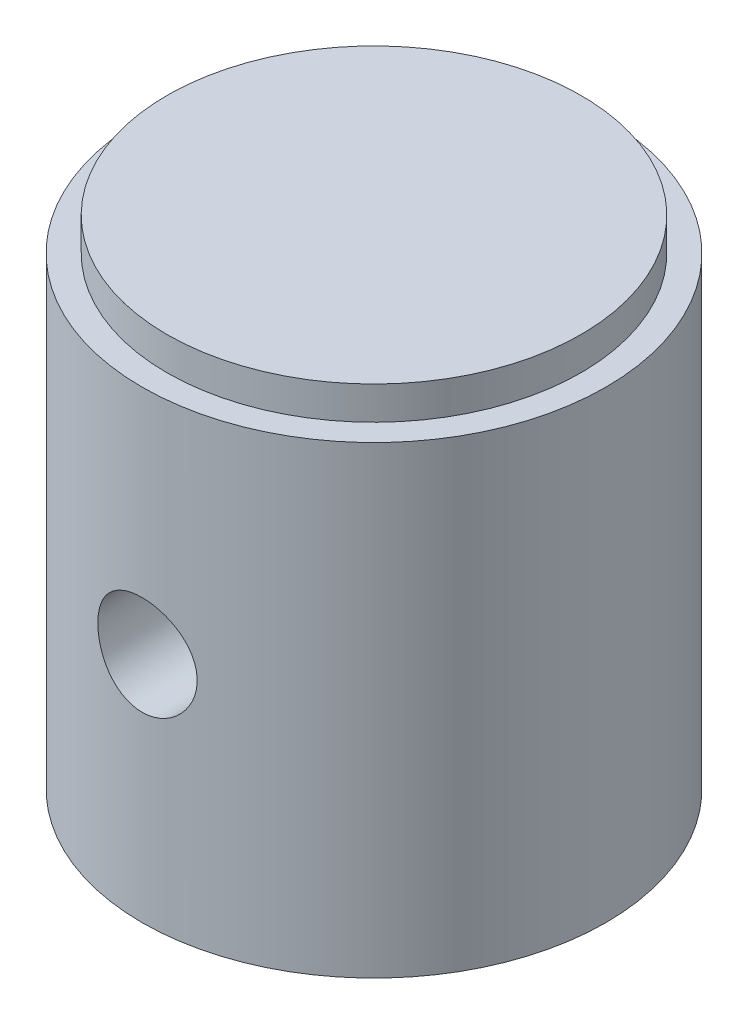
ISO-10303-21;
HEADER;
FILE_DESCRIPTION(('STEP AP214'),'2;1');
FILE_NAME('part.step','',(''),(''),'','','');
FILE_SCHEMA(('AUTOMOTIVE_DESIGN { 1 0 10303 214 1 1 1 1 }'));
ENDSEC;
DATA;
#1=APPLICATION_CONTEXT('core data for automotive mechanical design processes');
#2=APPLICATION_PROTOCOL_DEFINITION('international standard','automotive_design',2000,#1);
#3=PRODUCT_CONTEXT('',#1,'mechanical');
#4=PRODUCT('Part','Part','',(#3));
#5=PRODUCT_RELATED_PRODUCT_CATEGORY('part','',(#4));
#6=PRODUCT_DEFINITION_FORMATION('','',#4);
#7=PRODUCT_DEFINITION_CONTEXT('part definition',#1,'design');
#8=PRODUCT_DEFINITION('design','',#6,#7);
#9=PRODUCT_DEFINITION_SHAPE('','',#8);
#10=(LENGTH_UNIT() NAMED_UNIT(*) SI_UNIT(.MILLI.,.METRE.));
#11=(NAMED_UNIT(*) PLANE_ANGLE_UNIT() SI_UNIT($,.RADIAN.));
#12=(NAMED_UNIT(*) SI_UNIT($,.STERADIAN.) SOLID_ANGLE_UNIT());
#13=UNCERTAINTY_MEASURE_WITH_UNIT(LENGTH_MEASURE(1.E-05),#10,'distance_accuracy_value','');
#14=(GEOMETRIC_REPRESENTATION_CONTEXT(3) GLOBAL_UNCERTAINTY_ASSIGNED_CONTEXT((#13)) GLOBAL_UNIT_ASSIGNED_CONTEXT((#10,
#11,#12)) REPRESENTATION_CONTEXT('',''));
#15=CARTESIAN_POINT('',(0.,0.,0.));
#16=DIRECTION('',(0.,0.,1.));
#17=DIRECTION('',(1.,0.,0.));
#18=AXIS2_PLACEMENT_3D('',#15,#16,#17);
#19=CARTESIAN_POINT('',(0.,1.1459120596191,0.));
#20=DIRECTION('',(0.,1.,0.));
#21=DIRECTION('',(0.,0.,1.));
#22=AXIS2_PLACEMENT_3D('',#19,#20,#21);
#23=PLANE('',#22);
#24=CARTESIAN_POINT('',(0.,1.1459120596191,0.));
#25=DIRECTION('',(0.,1.,0.));
#26=DIRECTION('',(0.,0.,1.));
#27=AXIS2_PLACEMENT_3D('',#24,#25,#26);
#28=CIRCLE('',#27,6.25);
#29=CARTESIAN_POINT('',(0.,1.1459120596191,6.25));
#30=VERTEX_POINT('',#29);
#31=EDGE_CURVE('E11',#30,#30,#28,.T.);
#32=ORIENTED_EDGE('',*,*,#31,.T.);
#33=EDGE_LOOP('',(#32));
#34=FACE_BOUND('',#33,.T.);
#35=ADVANCED_FACE('F35',(#34),#23,.T.);
#36=CARTESIAN_POINT('',(0.,0.,0.));
#37=DIRECTION('',(0.,1.,0.));
#38=DIRECTION('',(0.,0.,1.));
#39=AXIS2_PLACEMENT_3D('',#36,#37,#38);
#40=CYLINDRICAL_SURFACE('',#39,6.25);
#41=CARTESIAN_POINT('',(0.,0.145912059619103,0.));
#42=DIRECTION('',(0.,1.,0.));
#43=DIRECTION('',(0.,0.,1.));
#44=AXIS2_PLACEMENT_3D('',#41,#42,#43);
#45=CIRCLE('',#44,6.25);
#46=CARTESIAN_POINT('',(0.,0.145912059619103,6.25));
#47=VERTEX_POINT('',#46);
#48=EDGE_CURVE('E46',#47,#47,#45,.T.);
#49=ORIENTED_EDGE('',*,*,#48,.T.);
#50=EDGE_LOOP('',(#49));
#51=FACE_BOUND('',#50,.T.);
#52=ORIENTED_EDGE('',*,*,#31,.F.);
#53=EDGE_LOOP('',(#52));
#54=FACE_BOUND('',#53,.T.);
#55=ADVANCED_FACE('F109',(#51,#54),#40,.T.);
#56=CARTESIAN_POINT('',(-6.25,0.145912059619103,0.));
#57=DIRECTION('',(0.,1.,0.));
#58=DIRECTION('',(0.,0.,1.));
#59=AXIS2_PLACEMENT_3D('',#56,#57,#58);
#60=PLANE('',#59);
#61=CARTESIAN_POINT('',(0.,0.145912059619103,0.));
#62=DIRECTION('',(0.,1.,0.));
#63=DIRECTION('',(0.,0.,1.));
#64=AXIS2_PLACEMENT_3D('',#61,#62,#63);
#65=CIRCLE('',#64,7.);
#66=CARTESIAN_POINT('',(0.,0.145912059619103,7.));
#67=VERTEX_POINT('',#66);
#68=EDGE_CURVE('E79',#67,#67,#65,.T.);
#69=ORIENTED_EDGE('',*,*,#68,.T.);
#70=EDGE_LOOP('',(#69));
#71=FACE_BOUND('',#70,.T.);
#72=ORIENTED_EDGE('',*,*,#48,.F.);
#73=EDGE_LOOP('',(#72));
#74=FACE_BOUND('',#73,.T.);
#75=ADVANCED_FACE('F105',(#71,#74),#60,.T.);
#76=CARTESIAN_POINT('',(0.,0.,0.));
#77=DIRECTION('',(0.,1.,0.));
#78=DIRECTION('',(0.,0.,1.));
#79=AXIS2_PLACEMENT_3D('',#76,#77,#78);
#80=CYLINDRICAL_SURFACE('',#79,7.);
#81=CARTESIAN_POINT('',(0.,-5.3540879403809,-7.));
#82=CARTESIAN_POINT('',(0.0832358860906166,-5.3540908399552,-6.99999846043226));
#83=CARTESIAN_POINT('',(0.166507195600275,-5.36103954876875,-6.9985002594971));
#84=CARTESIAN_POINT('',(0.330687344293327,-5.38862359723449,-6.99266829827727));
#85=CARTESIAN_POINT('',(0.41159440357119,-5.40926898457583,-6.98833245637099));
#86=CARTESIAN_POINT('',(0.568649323817737,-5.46357230498893,-6.97730831788826));
#87=CARTESIAN_POINT('',(0.644801963446556,-5.49721691976222,-6.97062242967171));
#88=CARTESIAN_POINT('',(0.790378177960787,-5.57652202655216,-6.9556210681797));
#89=CARTESIAN_POINT('',(0.859801981747369,-5.62218210963084,-6.9473056503666));
#90=CARTESIAN_POINT('',(0.99102479053523,-5.7249682400544,-6.92981369246311));
#91=CARTESIAN_POINT('',(1.05270503419445,-5.78224416227942,-6.92062683143259));
#92=CARTESIAN_POINT('',(1.16566042389435,-5.90631425606609,-6.90250069814144));
#93=CARTESIAN_POINT('',(1.21693467150908,-5.97310924863216,-6.8935614473163));
#94=CARTESIAN_POINT('',(1.30814204379809,-6.11519369324133,-6.87684116047225));
#95=CARTESIAN_POINT('',(1.34794958335009,-6.19056545813711,-6.8690733634436));
#96=CARTESIAN_POINT('',(1.41428823691148,-6.34712239414773,-6.85572325558537));
#97=CARTESIAN_POINT('',(1.44082087001716,-6.42830689887347,-6.85014069470711));
#98=CARTESIAN_POINT('',(1.47946574422454,-6.59289902696897,-6.8418980892631));
#99=CARTESIAN_POINT('',(1.49178779748342,-6.67625521604476,-6.83919556896486));
#100=CARTESIAN_POINT('',(1.50231395206577,-6.84389217288789,-6.83689139845105));
#101=CARTESIAN_POINT('',(1.50051971664629,-6.92817283056084,-6.83728938291729));
#102=CARTESIAN_POINT('',(1.48303326340861,-7.09371262831469,-6.84110276603832));
#103=CARTESIAN_POINT('',(1.46758398649408,-7.17499882948105,-6.84446541682162));
#104=CARTESIAN_POINT('',(1.42361054298677,-7.33379818067024,-6.85374593375788));
#105=CARTESIAN_POINT('',(1.39508566936466,-7.41131112641322,-6.85966393808402));
#106=CARTESIAN_POINT('',(1.32554551075991,-7.56105081325424,-6.87344080755724));
#107=CARTESIAN_POINT('',(1.2844361097283,-7.63323245309345,-6.88131420983365));
#108=CARTESIAN_POINT('',(1.19096007283993,-7.76976310533885,-6.89810572501288));
#109=CARTESIAN_POINT('',(1.13859196103562,-7.8341110890671,-6.90702397481896));
#110=CARTESIAN_POINT('',(1.0227954275532,-7.95454729605429,-6.92512718393878));
#111=CARTESIAN_POINT('',(0.959160233964411,-8.01043664696564,-6.93431383972177));
#112=CARTESIAN_POINT('',(0.823317306269096,-8.11078167407056,-6.95175017497059));
#113=CARTESIAN_POINT('',(0.7511094287754,-8.15523715898129,-6.95999983875972));
#114=CARTESIAN_POINT('',(0.599933462049959,-8.23149862028783,-6.97465778534003));
#115=CARTESIAN_POINT('',(0.520952258863482,-8.26327935295888,-6.98106238643354));
#116=CARTESIAN_POINT('',(0.358603146685706,-8.31306358870198,-6.99128109245333));
#117=CARTESIAN_POINT('',(0.275235851133669,-8.33106901294421,-6.99509555860383));
#118=CARTESIAN_POINT('',(0.108187670836629,-8.35250415452432,-6.99965306347808));
#119=CARTESIAN_POINT('',(0.0245431772716144,-8.35620565326268,-7.00045336521065));
#120=CARTESIAN_POINT('',(-0.142168973650405,-8.34966336925573,-6.99905248935969));
#121=CARTESIAN_POINT('',(-0.225236668127255,-8.33942049241796,-6.99685150675698));
#122=CARTESIAN_POINT('',(-0.387542537982806,-8.3055056967192,-6.98973143045266));
#123=CARTESIAN_POINT('',(-0.466811712908477,-8.28197557090837,-6.98484105045459));
#124=CARTESIAN_POINT('',(-0.620278450473418,-8.22231099738608,-6.9728892442151));
#125=CARTESIAN_POINT('',(-0.69447559258774,-8.18617550606924,-6.96582763822237));
#126=CARTESIAN_POINT('',(-0.836821397964754,-8.10175439732057,-6.950175043904));
#127=CARTESIAN_POINT('',(-0.904872575111141,-8.05330814547117,-6.94156431354275));
#128=CARTESIAN_POINT('',(-1.0319769255236,-7.94585311549216,-6.92381033034847));
#129=CARTESIAN_POINT('',(-1.091028978692,-7.88684302449345,-6.91466701142097));
#130=CARTESIAN_POINT('',(-1.19952711057989,-7.75869057019376,-6.89668172706324));
#131=CARTESIAN_POINT('',(-1.24878537255157,-7.68938784115879,-6.88784792221285));
#132=CARTESIAN_POINT('',(-1.3349641538604,-7.5433333439029,-6.87166654559681));
#133=CARTESIAN_POINT('',(-1.37188519913706,-7.46658189340341,-6.86431891048055));
#134=CARTESIAN_POINT('',(-1.43209741248548,-7.30821564138629,-6.8520100980739));
#135=CARTESIAN_POINT('',(-1.45546398641275,-7.22663058395023,-6.84703574582967));
#136=CARTESIAN_POINT('',(-1.48812696085335,-7.06057235654726,-6.84001186708418));
#137=CARTESIAN_POINT('',(-1.49742550780258,-6.97609962917958,-6.83796189439705));
#138=CARTESIAN_POINT('',(-1.5015999992604,-6.80855559720565,-6.83704618848155));
#139=CARTESIAN_POINT('',(-1.49677347258311,-6.72549192540032,-6.83811476518543));
#140=CARTESIAN_POINT('',(-1.47349789406331,-6.56139069824831,-6.8431676318483));
#141=CARTESIAN_POINT('',(-1.45504898957979,-6.48035312099432,-6.84715189026714));
#142=CARTESIAN_POINT('',(-1.40519345940434,-6.32282928251173,-6.85755581104157));
#143=CARTESIAN_POINT('',(-1.37382847170887,-6.24632929171661,-6.86396764224703));
#144=CARTESIAN_POINT('',(-1.29906751595601,-6.09963256787405,-6.87850764590649));
#145=CARTESIAN_POINT('',(-1.255670353015,-6.02943646176585,-6.88663598880362));
#146=CARTESIAN_POINT('',(-1.15708290349304,-5.89586974665553,-6.90389055593232));
#147=CARTESIAN_POINT('',(-1.10167987421237,-5.83265824443392,-6.91303309938926));
#148=CARTESIAN_POINT('',(-0.981086554619621,-5.71633167786044,-6.93117449799694));
#149=CARTESIAN_POINT('',(-0.915894009385597,-5.66321894606869,-6.94017331951296));
#150=CARTESIAN_POINT('',(-0.776603147268717,-5.56797198087533,-6.95714491048987));
#151=CARTESIAN_POINT('',(-0.702404846009641,-5.52598133414992,-6.96510364570626));
#152=CARTESIAN_POINT('',(-0.547850160940598,-5.45513341147471,-6.97895826104019));
#153=CARTESIAN_POINT('',(-0.46749910586388,-5.42626491779586,-6.98485590212342));
#154=CARTESIAN_POINT('',(-0.322535217553203,-5.38773575524975,-6.99284848461771));
#155=CARTESIAN_POINT('',(-0.258717205545978,-5.37514150640087,-6.99551391888263));
#156=CARTESIAN_POINT('',(-0.129939960853846,-5.35831663866923,-6.99909024154719));
#157=CARTESIAN_POINT('',(-0.0649807750887446,-5.35408567673484,-7.00000120191314));
#158=CARTESIAN_POINT('',(0.,-5.3540879403809,-7.));
#159=B_SPLINE_CURVE_WITH_KNOTS('',3,(#81,#82,#83,#84,#85,#86,#87,#88,#89,#90,#91,#92,#93,#94,
#95,#96,#97,#98,#99,#100,#101,#102,#103,#104,#105,#106,#107,#108,#109,#110,#111,#112,#113,#114,
#115,#116,#117,#118,#119,#120,#121,#122,#123,#124,#125,#126,#127,#128,#129,#130,#131,#132,#133,
#134,#135,#136,#137,#138,#139,#140,#141,#142,#143,#144,#145,#146,#147,#148,#149,#150,#151,#152,
#153,#154,#155,#156,#157,#158),.UNSPECIFIED.,.T.,.F.,(4,2,2,2,2,2,2,2,2,2,2,2,2,2,2,2,2,2,2,2,2,
2,2,2,2,2,2,2,2,2,2,2,2,2,2,2,2,2,4),(0.,0.249469836512082,0.499122883219936,0.748520824425602,
0.997910278645887,1.25074961881732,1.50361077918506,1.7591442921451,2.0146485567749,
2.26633008124666,2.51798195169165,2.76524475452928,3.01252092904568,3.26169356165968,
3.51089887920889,3.76527011050291,4.0196455970235,4.27452521139806,4.52936927256343,
4.77934665704185,5.02930780231429,5.27665060589267,5.52401389198434,5.77478733867803,
6.02559197304485,6.28082063283534,6.53603841075806,6.78982240408475,7.04356767229185,
7.29200680540294,7.5404432510827,7.78808499706785,8.03575134451623,8.28822950154114,
8.54076590397115,8.79641910357222,9.05185334010271,9.24661799132294,9.44137465337336),.UNSPECIFIED.);
#160=CARTESIAN_POINT('',(0.,-5.3540879403809,-7.));
#161=VERTEX_POINT('',#160);
#162=EDGE_CURVE('E67',#161,#161,#159,.T.);
#163=ORIENTED_EDGE('',*,*,#162,.F.);
#164=EDGE_LOOP('',(#163));
#165=FACE_BOUND('',#164,.T.);
#166=CARTESIAN_POINT('',(0.,-8.3540879403809,7.));
#167=CARTESIAN_POINT('',(0.0832358860906165,-8.3540850408066,6.99999846043226));
#168=CARTESIAN_POINT('',(0.166507195600275,-8.34713633199304,6.9985002594971));
#169=CARTESIAN_POINT('',(0.330687344293327,-8.3195522835273,6.99266829827727));
#170=CARTESIAN_POINT('',(0.41159440357119,-8.29890689618596,6.98833245637099));
#171=CARTESIAN_POINT('',(0.568649323817737,-8.24460357577286,6.97730831788826));
#172=CARTESIAN_POINT('',(0.644801963446556,-8.21095896099958,6.97062242967171));
#173=CARTESIAN_POINT('',(0.790378177960788,-8.13165385420963,6.9556210681797));
#174=CARTESIAN_POINT('',(0.85980198174737,-8.08599377113095,6.9473056503666));
#175=CARTESIAN_POINT('',(0.99102479053523,-7.98320764070739,6.9298136924631));
#176=CARTESIAN_POINT('',(1.05270503419445,-7.92593171848237,6.92062683143259));
#177=CARTESIAN_POINT('',(1.16566042389435,-7.8018616246957,6.90250069814144));
#178=CARTESIAN_POINT('',(1.21693467150908,-7.73506663212964,6.8935614473163));
#179=CARTESIAN_POINT('',(1.30814204379809,-7.59298218752046,6.87684116047225));
#180=CARTESIAN_POINT('',(1.34794958335009,-7.51761042262469,6.8690733634436));
#181=CARTESIAN_POINT('',(1.41428823691148,-7.36105348661406,6.85572325558537));
#182=CARTESIAN_POINT('',(1.44082087001716,-7.27986898188832,6.85014069470711));
#183=CARTESIAN_POINT('',(1.47946574422454,-7.11527685379282,6.8418980892631));
#184=CARTESIAN_POINT('',(1.49178779748342,-7.03192066471703,6.83919556896486));
#185=CARTESIAN_POINT('',(1.50231395206577,-6.8642837078739,6.83689139845105));
#186=CARTESIAN_POINT('',(1.50051971664629,-6.78000305020095,6.83728938291729));
#187=CARTESIAN_POINT('',(1.48303326340861,-6.6144632524471,6.84110276603832));
#188=CARTESIAN_POINT('',(1.46758398649408,-6.53317705128074,6.84446541682162));
#189=CARTESIAN_POINT('',(1.42361054298677,-6.37437770009156,6.85374593375787));
#190=CARTESIAN_POINT('',(1.39508566936466,-6.29686475434858,6.85966393808402));
#191=CARTESIAN_POINT('',(1.32554551075991,-6.14712506750756,6.87344080755724));
#192=CARTESIAN_POINT('',(1.2844361097283,-6.07494342766835,6.88131420983365));
#193=CARTESIAN_POINT('',(1.19096007283993,-5.93841277542294,6.89810572501288));
#194=CARTESIAN_POINT('',(1.13859196103562,-5.8740647916947,6.90702397481896));
#195=CARTESIAN_POINT('',(1.0227954275532,-5.7536285847075,6.92512718393878));
#196=CARTESIAN_POINT('',(0.95916023396441,-5.69773923379616,6.93431383972178));
#197=CARTESIAN_POINT('',(0.823317306269096,-5.59739420669124,6.95175017497059));
#198=CARTESIAN_POINT('',(0.7511094287754,-5.55293872178051,6.95999983875972));
#199=CARTESIAN_POINT('',(0.599933462049959,-5.47667726047397,6.97465778534003));
#200=CARTESIAN_POINT('',(0.520952258863482,-5.44489652780291,6.98106238643354));
#201=CARTESIAN_POINT('',(0.358603146685706,-5.39511229205981,6.99128109245333));
#202=CARTESIAN_POINT('',(0.275235851133669,-5.37710686781758,6.99509555860383));
#203=CARTESIAN_POINT('',(0.108187670836629,-5.35567172623747,6.99965306347808));
#204=CARTESIAN_POINT('',(0.0245431772716144,-5.35197022749912,7.00045336521065));
#205=CARTESIAN_POINT('',(-0.142168973650405,-5.35851251150606,6.99905248935969));
#206=CARTESIAN_POINT('',(-0.225236668127255,-5.36875538834384,6.99685150675698));
#207=CARTESIAN_POINT('',(-0.387542537982806,-5.4026701840426,6.98973143045266));
#208=CARTESIAN_POINT('',(-0.466811712908478,-5.42620030985343,6.98484105045459));
#209=CARTESIAN_POINT('',(-0.620278450473418,-5.48586488337572,6.9728892442151));
#210=CARTESIAN_POINT('',(-0.69447559258774,-5.52200037469255,6.96582763822237));
#211=CARTESIAN_POINT('',(-0.836821397964754,-5.60642148344122,6.950175043904));
#212=CARTESIAN_POINT('',(-0.90487257511114,-5.65486773529063,6.94156431354275));
#213=CARTESIAN_POINT('',(-1.0319769255236,-5.76232276526963,6.92381033034847));
#214=CARTESIAN_POINT('',(-1.091028978692,-5.82133285626834,6.91466701142097));
#215=CARTESIAN_POINT('',(-1.19952711057989,-5.94948531056803,6.89668172706324));
#216=CARTESIAN_POINT('',(-1.24878537255157,-6.018788039603,6.88784792221285));
#217=CARTESIAN_POINT('',(-1.3349641538604,-6.16484253685889,6.87166654559681));
#218=CARTESIAN_POINT('',(-1.37188519913706,-6.24159398735839,6.86431891048054));
#219=CARTESIAN_POINT('',(-1.43209741248548,-6.3999602393755,6.8520100980739));
#220=CARTESIAN_POINT('',(-1.45546398641275,-6.48154529681157,6.84703574582967));
#221=CARTESIAN_POINT('',(-1.48812696085335,-6.64760352421453,6.84001186708418));
#222=CARTESIAN_POINT('',(-1.49742550780258,-6.73207625158222,6.83796189439705));
#223=CARTESIAN_POINT('',(-1.5015999992604,-6.89962028355614,6.83704618848155));
#224=CARTESIAN_POINT('',(-1.49677347258311,-6.98268395536148,6.83811476518543));
#225=CARTESIAN_POINT('',(-1.47349789406331,-7.14678518251348,6.8431676318483));
#226=CARTESIAN_POINT('',(-1.45504898957979,-7.22782275976747,6.84715189026714));
#227=CARTESIAN_POINT('',(-1.40519345940434,-7.38534659825006,6.85755581104157));
#228=CARTESIAN_POINT('',(-1.37382847170887,-7.46184658904519,6.86396764224703));
#229=CARTESIAN_POINT('',(-1.29906751595601,-7.60854331288775,6.87850764590649));
#230=CARTESIAN_POINT('',(-1.255670353015,-7.67873941899594,6.88663598880363));
#231=CARTESIAN_POINT('',(-1.15708290349304,-7.81230613410626,6.90389055593232));
#232=CARTESIAN_POINT('',(-1.10167987421237,-7.87551763632787,6.91303309938926));
#233=CARTESIAN_POINT('',(-0.98108655461962,-7.99184420290136,6.93117449799694));
#234=CARTESIAN_POINT('',(-0.915894009385596,-8.0449569346931,6.94017331951296));
#235=CARTESIAN_POINT('',(-0.776603147268717,-8.14020389988646,6.95714491048987));
#236=CARTESIAN_POINT('',(-0.702404846009641,-8.18219454661188,6.96510364570626));
#237=CARTESIAN_POINT('',(-0.547850160940599,-8.25304246928708,6.97895826104018));
#238=CARTESIAN_POINT('',(-0.467499105863881,-8.28191096296593,6.98485590212342));
#239=CARTESIAN_POINT('',(-0.322535217553205,-8.32044012551205,6.99284848461771));
#240=CARTESIAN_POINT('',(-0.25871720554598,-8.33303437436093,6.99551391888263));
#241=CARTESIAN_POINT('',(-0.129939960853846,-8.34985924209257,6.99909024154719));
#242=CARTESIAN_POINT('',(-0.064980775088745,-8.35409020402696,7.00000120191314));
#243=CARTESIAN_POINT('',(0.,-8.3540879403809,7.));
#244=B_SPLINE_CURVE_WITH_KNOTS('',3,(#166,#167,#168,#169,#170,#171,#172,#173,#174,#175,#176,
#177,#178,#179,#180,#181,#182,#183,#184,#185,#186,#187,#188,#189,#190,#191,#192,#193,#194,#195,
#196,#197,#198,#199,#200,#201,#202,#203,#204,#205,#206,#207,#208,#209,#210,#211,#212,#213,#214,
#215,#216,#217,#218,#219,#220,#221,#222,#223,#224,#225,#226,#227,#228,#229,#230,#231,#232,#233,
#234,#235,#236,#237,#238,#239,#240,#241,#242,#243),.UNSPECIFIED.,.T.,.F.,(4,2,2,2,2,2,2,2,2,2,2,
2,2,2,2,2,2,2,2,2,2,2,2,2,2,2,2,2,2,2,2,2,2,2,2,2,2,2,4),(0.,0.249469836512082,
0.499122883219936,0.748520824425603,0.997910278645887,1.25074961881732,1.50361077918506,
1.7591442921451,2.0146485567749,2.26633008124666,2.51798195169165,2.76524475452928,
3.01252092904568,3.26169356165968,3.51089887920889,3.76527011050291,4.0196455970235,
4.27452521139806,4.52936927256343,4.77934665704185,5.02930780231429,5.27665060589267,
5.52401389198434,5.77478733867803,6.02559197304485,6.28082063283534,6.53603841075806,
6.78982240408475,7.04356767229185,7.29200680540294,7.5404432510827,7.78808499706785,
8.03575134451623,8.28822950154114,8.54076590397115,8.79641910357222,9.05185334010271,
9.24661799132294,9.44137465337336),.UNSPECIFIED.);
#245=CARTESIAN_POINT('',(0.,-8.3540879403809,7.));
#246=VERTEX_POINT('',#245);
#247=EDGE_CURVE('E61',#246,#246,#244,.T.);
#248=ORIENTED_EDGE('',*,*,#247,.F.);
#249=EDGE_LOOP('',(#248));
#250=FACE_BOUND('',#249,.T.);
#251=CARTESIAN_POINT('',(0.,-13.8540879403809,0.));
#252=DIRECTION('',(0.,1.,0.));
#253=DIRECTION('',(0.,0.,1.));
#254=AXIS2_PLACEMENT_3D('',#251,#252,#253);
#255=CIRCLE('',#254,7.);
#256=CARTESIAN_POINT('',(0.,-13.8540879403809,7.));
#257=VERTEX_POINT('',#256);
#258=EDGE_CURVE('E76',#257,#257,#255,.T.);
#259=ORIENTED_EDGE('',*,*,#258,.T.);
#260=EDGE_LOOP('',(#259));
#261=FACE_BOUND('',#260,.T.);
#262=ORIENTED_EDGE('',*,*,#68,.F.);
#263=EDGE_LOOP('',(#262));
#264=FACE_BOUND('',#263,.T.);
#265=ADVANCED_FACE('F99',(#165,#250,#261,#264),#80,.T.);
#266=CARTESIAN_POINT('',(-7.,-13.8540879403809,0.));
#267=DIRECTION('',(0.,-1.,0.));
#268=DIRECTION('',(0.,0.,-1.));
#269=AXIS2_PLACEMENT_3D('',#266,#267,#268);
#270=PLANE('',#269);
#271=CARTESIAN_POINT('',(0.,-13.8540879403809,0.));
#272=DIRECTION('',(0.,1.,0.));
#273=DIRECTION('',(0.,0.,1.));
#274=AXIS2_PLACEMENT_3D('',#271,#272,#273);
#275=CIRCLE('',#274,6.25);
#276=CARTESIAN_POINT('',(0.,-13.8540879403809,6.25));
#277=VERTEX_POINT('',#276);
#278=EDGE_CURVE('E64',#277,#277,#275,.T.);
#279=ORIENTED_EDGE('',*,*,#278,.T.);
#280=EDGE_LOOP('',(#279));
#281=FACE_BOUND('',#280,.T.);
#282=ORIENTED_EDGE('',*,*,#258,.F.);
#283=EDGE_LOOP('',(#282));
#284=FACE_BOUND('',#283,.T.);
#285=ADVANCED_FACE('F104',(#281,#284),#270,.T.);
#286=CARTESIAN_POINT('',(0.,-13.8540879403809,0.));
#287=DIRECTION('',(0.,-1.,0.));
#288=DIRECTION('',(0.,0.,-1.));
#289=AXIS2_PLACEMENT_3D('',#286,#287,#288);
#290=CONICAL_SURFACE('',#289,6.25,0.349065850398867);
#291=CARTESIAN_POINT('',(0.,-9.73287181119897,0.));
#292=DIRECTION('',(0.,1.,0.));
#293=DIRECTION('',(0.,0.,1.));
#294=AXIS2_PLACEMENT_3D('',#291,#292,#293);
#295=CIRCLE('',#294,4.75);
#296=CARTESIAN_POINT('',(0.,-9.73287181119897,4.75));
#297=VERTEX_POINT('',#296);
#298=EDGE_CURVE('E60',#297,#297,#295,.T.);
#299=ORIENTED_EDGE('',*,*,#298,.T.);
#300=EDGE_LOOP('',(#299));
#301=FACE_BOUND('',#300,.T.);
#302=ORIENTED_EDGE('',*,*,#278,.F.);
#303=EDGE_LOOP('',(#302));
#304=FACE_BOUND('',#303,.T.);
#305=ADVANCED_FACE('F143',(#301,#304),#290,.F.);
#306=CARTESIAN_POINT('',(0.,0.,0.));
#307=DIRECTION('',(0.,1.,0.));
#308=DIRECTION('',(0.,0.,1.));
#309=AXIS2_PLACEMENT_3D('',#306,#307,#308);
#310=CYLINDRICAL_SURFACE('',#309,4.75);
#311=CARTESIAN_POINT('',(0.,-8.3540879403809,4.75));
#312=CARTESIAN_POINT('',(-0.0820835447314043,-8.3540875363838,4.74999967904615));
#313=CARTESIAN_POINT('',(-0.164171496501827,-8.34732807088629,4.74785228936723));
#314=CARTESIAN_POINT('',(-0.325944116631497,-8.32054149115772,4.73949648091444));
#315=CARTESIAN_POINT('',(-0.405628283459122,-8.30051162790363,4.73328722070904));
#316=CARTESIAN_POINT('',(-0.560237269504344,-8.24792898419689,4.71748543187023));
#317=CARTESIAN_POINT('',(-0.63516933409095,-8.21539582927393,4.7078982073406));
#318=CARTESIAN_POINT('',(-0.778514579207215,-8.13881440395221,4.68632862599565));
#319=CARTESIAN_POINT('',(-0.846926688392995,-8.09476424554246,4.67434587655187));
#320=CARTESIAN_POINT('',(-0.977443078754499,-7.99494060295447,4.64883376662147));
#321=CARTESIAN_POINT('',(-1.03931346588882,-7.93887009164411,4.63527018347254));
#322=CARTESIAN_POINT('',(-1.15294742613926,-7.81722966025813,4.60832176901776));
#323=CARTESIAN_POINT('',(-1.2047090669501,-7.75165792817148,4.5949369723419));
#324=CARTESIAN_POINT('',(-1.29793466853577,-7.61083915826502,4.56949296853185));
#325=CARTESIAN_POINT('',(-1.33910462019172,-7.53538913693675,4.55747591989588));
#326=CARTESIAN_POINT('',(-1.40807389327236,-7.37819547860465,4.53664362085522));
#327=CARTESIAN_POINT('',(-1.43587682167781,-7.29645354633555,4.52782750686213));
#328=CARTESIAN_POINT('',(-1.47646364106285,-7.13163903801145,4.51475360613692));
#329=CARTESIAN_POINT('',(-1.48968210274354,-7.0486842059721,4.51036428133252));
#330=CARTESIAN_POINT('',(-1.50208257395981,-6.88162704216104,4.50625061102435));
#331=CARTESIAN_POINT('',(-1.50126840605207,-6.79752502912434,4.50652499510326));
#332=CARTESIAN_POINT('',(-1.48596623804714,-6.634172421542,4.51159176137022));
#333=CARTESIAN_POINT('',(-1.47203288124122,-6.55486322414007,4.51620087396631));
#334=CARTESIAN_POINT('',(-1.43178798005592,-6.3997714129383,4.52911970742075));
#335=CARTESIAN_POINT('',(-1.40547509472982,-6.32398918215587,4.53742982916608));
#336=CARTESIAN_POINT('',(-1.34083084084602,-6.17679067250524,4.55695325959034));
#337=CARTESIAN_POINT('',(-1.30232683858134,-6.10545591722608,4.56820783899944));
#338=CARTESIAN_POINT('',(-1.21451321691615,-5.97007911603132,4.59233341866295));
#339=CARTESIAN_POINT('',(-1.16520074091948,-5.90603900484641,4.60520484585311));
#340=CARTESIAN_POINT('',(-1.05445721763047,-5.7839365788824,4.63184688202887));
#341=CARTESIAN_POINT('',(-0.992568961591256,-5.72629121130677,4.64563145900086));
#342=CARTESIAN_POINT('',(-0.859832533931192,-5.62209470011079,4.67201892608795));
#343=CARTESIAN_POINT('',(-0.78898367078958,-5.57554441353649,4.68462172487032));
#344=CARTESIAN_POINT('',(-0.639521244304238,-5.49456889590612,4.70736283385871));
#345=CARTESIAN_POINT('',(-0.56084940322956,-5.4602449943565,4.71748034190943));
#346=CARTESIAN_POINT('',(-0.398454273025005,-5.40544316257892,4.73396063106369));
#347=CARTESIAN_POINT('',(-0.314732560358458,-5.38496093539116,4.74032457733139));
#348=CARTESIAN_POINT('',(-0.148151942001063,-5.35913848124175,4.74839235389519));
#349=CARTESIAN_POINT('',(-0.0653887879529908,-5.35323397457855,4.75026975398177));
#350=CARTESIAN_POINT('',(0.0999556894804196,-5.35514105779726,4.74966735792893));
#351=CARTESIAN_POINT('',(0.182537038204381,-5.36295059684291,4.74718821327919));
#352=CARTESIAN_POINT('',(0.342984606452105,-5.39161203026497,4.73826543461407));
#353=CARTESIAN_POINT('',(0.420917353280695,-5.41212653166031,4.73192442641254));
#354=CARTESIAN_POINT('',(0.572211571751272,-5.46520231351727,4.71602217273612));
#355=CARTESIAN_POINT('',(0.645572474036247,-5.49776509092812,4.70646052712339));
#356=CARTESIAN_POINT('',(0.787656381223484,-5.5749110304446,4.68480447515659));
#357=CARTESIAN_POINT('',(0.856220098995369,-5.61977119745397,4.67265334948307));
#358=CARTESIAN_POINT('',(0.98503489825459,-5.71990726150697,4.64720609363859));
#359=CARTESIAN_POINT('',(1.04528367215737,-5.77518603992166,4.63390964727142));
#360=CARTESIAN_POINT('',(1.15829337789972,-5.89724453712355,4.60699149316922));
#361=CARTESIAN_POINT('',(1.21065200367447,-5.96439950095235,4.593378435549));
#362=CARTESIAN_POINT('',(1.3033950666371,-6.10683797892431,4.5679297313532));
#363=CARTESIAN_POINT('',(1.34377965554056,-6.18212139006049,4.55609406225838));
#364=CARTESIAN_POINT('',(1.41118548758715,-6.33854988926153,4.53566962908159));
#365=CARTESIAN_POINT('',(1.43825519702983,-6.41967246730515,4.52706911631109));
#366=CARTESIAN_POINT('',(1.47824972090378,-6.58565274050353,4.5141696846939));
#367=CARTESIAN_POINT('',(1.49118006577835,-6.670508961769,4.50986908404445));
#368=CARTESIAN_POINT('',(1.50212620605735,-6.8373348663111,4.50623416787646));
#369=CARTESIAN_POINT('',(1.50080314084641,-6.91925690037935,4.50667969384457));
#370=CARTESIAN_POINT('',(1.48488083195079,-7.08164959826716,4.51195053556042));
#371=CARTESIAN_POINT('',(1.47028223238921,-7.16212033230999,4.51677563881295));
#372=CARTESIAN_POINT('',(1.42866989928935,-7.31811641116342,4.53010652438159));
#373=CARTESIAN_POINT('',(1.40184917312304,-7.39369851316925,4.53855497041869));
#374=CARTESIAN_POINT('',(1.33670650315647,-7.5393499361697,4.55816492249634));
#375=CARTESIAN_POINT('',(1.29838218467217,-7.60941811515336,4.56932698861838));
#376=CARTESIAN_POINT('',(1.2095354013046,-7.74507468567842,4.5936611779216));
#377=CARTESIAN_POINT('',(1.15858784628932,-7.81037344864929,4.60689565835744));
#378=CARTESIAN_POINT('',(1.0466842406539,-7.93170877801159,4.63360081206469));
#379=CARTESIAN_POINT('',(0.985725490335815,-7.98774283780803,4.64707154816902));
#380=CARTESIAN_POINT('',(0.85306632642395,-8.09084486468598,4.67327443028954));
#381=CARTESIAN_POINT('',(0.781073823515225,-8.13754833111056,4.68596655437371));
#382=CARTESIAN_POINT('',(0.62985947284286,-8.21812962475189,4.70867379243004));
#383=CARTESIAN_POINT('',(0.550640331972044,-8.25201223001548,4.71868990328235));
#384=CARTESIAN_POINT('',(0.393635914977815,-8.30368670948412,4.7342664308075));
#385=CARTESIAN_POINT('',(0.316225133186437,-8.32253181996649,4.74011460510933));
#386=CARTESIAN_POINT('',(0.159210635950565,-8.34773130304534,4.7479811380776));
#387=CARTESIAN_POINT('',(0.0796073905560843,-8.35408833219092,4.75000031127187));
#388=CARTESIAN_POINT('',(0.,-8.3540879403809,4.75));
#389=B_SPLINE_CURVE_WITH_KNOTS('',3,(#311,#312,#313,#314,#315,#316,#317,#318,#319,#320,#321,
#322,#323,#324,#325,#326,#327,#328,#329,#330,#331,#332,#333,#334,#335,#336,#337,#338,#339,#340,
#341,#342,#343,#344,#345,#346,#347,#348,#349,#350,#351,#352,#353,#354,#355,#356,#357,#358,#359,
#360,#361,#362,#363,#364,#365,#366,#367,#368,#369,#370,#371,#372,#373,#374,#375,#376,#377,#378,
#379,#380,#381,#382,#383,#384,#385,#386,#387,#388),.UNSPECIFIED.,.T.,.F.,(4,2,2,2,2,2,2,2,2,2,2,
2,2,2,2,2,2,2,2,2,2,2,2,2,2,2,2,2,2,2,2,2,2,2,2,2,2,2,4),(0.,0.24595797085269,0.491966908951221,
0.737591271008996,0.9832559241528,1.23588716608584,1.4885666517754,1.74764569043263,
2.00665477945945,2.25771831624514,2.50871346318116,2.74955211816805,2.99041686673246,
3.23485763830864,3.47936309176113,3.73524847406481,3.99115361598384,4.24913282924923,
4.50703191953741,4.75477968540458,5.00249040554177,5.24388939060298,5.48531837858214,
5.73270991189647,5.98016996447342,6.23765665880274,6.49514009053908,6.75167921313646,
7.00811795759371,7.25271509638718,7.49730036806766,7.73815036093372,7.97905010664366,
8.22954585775128,8.48010927077556,8.73909121554316,8.99797654827697,9.23656564494835,
9.47510398183575),.UNSPECIFIED.);
#390=CARTESIAN_POINT('',(0.,-8.3540879403809,4.75));
#391=VERTEX_POINT('',#390);
#392=EDGE_CURVE('E38',#391,#391,#389,.T.);
#393=ORIENTED_EDGE('',*,*,#392,.F.);
#394=EDGE_LOOP('',(#393));
#395=FACE_BOUND('',#394,.T.);
#396=CARTESIAN_POINT('',(1.5,-6.8540879403809,-4.50693909432999));
#397=CARTESIAN_POINT('',(1.49999958004515,-6.77211965770476,-4.50693949515469));
#398=CARTESIAN_POINT('',(1.49325840231682,-6.69014695665615,-4.50919970874085));
#399=CARTESIAN_POINT('',(1.46655104887094,-6.52861293088145,-4.5179553253781));
#400=CARTESIAN_POINT('',(1.44658152131253,-6.44905222265821,-4.52445180182028));
#401=CARTESIAN_POINT('',(1.39417508352591,-6.29470573753137,-4.54087234787262));
#402=CARTESIAN_POINT('',(1.36176059537411,-6.21991165356938,-4.55079024986066));
#403=CARTESIAN_POINT('',(1.28545946652237,-6.07680188437625,-4.57292751994247));
#404=CARTESIAN_POINT('',(1.24157071835092,-6.00848739239293,-4.58514731070763));
#405=CARTESIAN_POINT('',(1.14191784971278,-5.87787926892884,-4.6109923380212));
#406=CARTESIAN_POINT('',(1.08582030493755,-5.81584637664499,-4.62464992232587));
#407=CARTESIAN_POINT('',(0.964055421977067,-5.70189358755739,-4.65155671093151));
#408=CARTESIAN_POINT('',(0.89838672023377,-5.64997513417725,-4.66480585671778));
#409=CARTESIAN_POINT('',(0.757464836701734,-5.55656943425551,-4.68977365915903));
#410=CARTESIAN_POINT('',(0.682025001056138,-5.51535142867755,-4.70144979545653));
#411=CARTESIAN_POINT('',(0.524852067423558,-5.44629068315632,-4.72157773016224));
#412=CARTESIAN_POINT('',(0.443120487221092,-5.41844472907475,-4.73003030329318));
#413=CARTESIAN_POINT('',(0.278414775826808,-5.37779120927978,-4.74252974850081));
#414=CARTESIAN_POINT('',(0.195560751143444,-5.36453783892484,-4.74670693307633));
#415=CARTESIAN_POINT('',(0.0287067286102969,-5.35203243628333,-4.75064554540298));
#416=CARTESIAN_POINT('',(-0.0552929988694205,-5.35277715587082,-4.75040799755164));
#417=CARTESIAN_POINT('',(-0.218913619351865,-5.36795513993678,-4.74563427350171));
#418=CARTESIAN_POINT('',(-0.298584494979866,-5.38190499009775,-4.74124990899214));
#419=CARTESIAN_POINT('',(-0.45439031175481,-5.42230309803132,-4.72886249486103));
#420=CARTESIAN_POINT('',(-0.530525020335842,-5.44875217657589,-4.72085920760149));
#421=CARTESIAN_POINT('',(-0.678203652675078,-5.51370412226572,-4.7019310355991));
#422=CARTESIAN_POINT('',(-0.74967901329581,-5.55235226805688,-4.69097118266663));
#423=CARTESIAN_POINT('',(-0.885279102378908,-5.64048825496804,-4.66728249867119));
#424=CARTESIAN_POINT('',(-0.949401935733848,-5.68997888120315,-4.65455321340063));
#425=CARTESIAN_POINT('',(-1.07135837440922,-5.80086990661582,-4.62803989727125));
#426=CARTESIAN_POINT('',(-1.12880871974839,-5.86268717443348,-4.61423403233704));
#427=CARTESIAN_POINT('',(-1.23264301054731,-5.99520609936004,-4.58758892442481));
#428=CARTESIAN_POINT('',(-1.2790255944206,-6.06590884795349,-4.57474980051078));
#429=CARTESIAN_POINT('',(-1.35986638692084,-6.21529471221215,-4.55138024059369));
#430=CARTESIAN_POINT('',(-1.39417963639867,-6.29406107899699,-4.54087839223385));
#431=CARTESIAN_POINT('',(-1.44893342452635,-6.45666604209651,-4.5237069894911));
#432=CARTESIAN_POINT('',(-1.46937907304313,-6.54050275769753,-4.5170360236621));
#433=CARTESIAN_POINT('',(-1.49507161979024,-6.70719030070481,-4.5085959379324));
#434=CARTESIAN_POINT('',(-1.50090655288536,-6.78994094405966,-4.50663729609299));
#435=CARTESIAN_POINT('',(-1.49886513965521,-6.95524565634738,-4.50731687465407));
#436=CARTESIAN_POINT('',(-1.49099096720734,-7.03779975436817,-4.50995436623754));
#437=CARTESIAN_POINT('',(-1.46228084598241,-7.19781462827837,-4.51934163323602));
#438=CARTESIAN_POINT('',(-1.4418371919129,-7.27535386104785,-4.5259668251803));
#439=CARTESIAN_POINT('',(-1.38903056686353,-7.42589187285971,-4.54245022183902));
#440=CARTESIAN_POINT('',(-1.35666562487664,-7.49888989874712,-4.55230896114271));
#441=CARTESIAN_POINT('',(-1.2798587413425,-7.64062964410241,-4.57450539166733));
#442=CARTESIAN_POINT('',(-1.2350921421442,-7.70918516865475,-4.58690698850856));
#443=CARTESIAN_POINT('',(-1.13512998682984,-7.83802498613947,-4.61266077618539));
#444=CARTESIAN_POINT('',(-1.07993166463934,-7.8983070779543,-4.62601321856053));
#445=CARTESIAN_POINT('',(-0.957886037531119,-8.01152971698889,-4.65285013455169));
#446=CARTESIAN_POINT('',(-0.890643665109766,-8.06404992326931,-4.66631614662306));
#447=CARTESIAN_POINT('',(-0.747973360630615,-8.15707924857223,-4.6912975579683));
#448=CARTESIAN_POINT('',(-0.672545793179843,-8.19758890230138,-4.70281304406929));
#449=CARTESIAN_POINT('',(-0.516099288450846,-8.26506030291253,-4.72253168708172));
#450=CARTESIAN_POINT('',(-0.435125281433141,-8.29211897216542,-4.73075845435933));
#451=CARTESIAN_POINT('',(-0.269469399491866,-8.3321409847239,-4.7430763734001));
#452=CARTESIAN_POINT('',(-0.18478872100236,-8.34510884184614,-4.74716884950256));
#453=CARTESIAN_POINT('',(-0.0179886485878235,-8.35620824364676,-4.7506674317259));
#454=CARTESIAN_POINT('',(0.0640868361538652,-8.35494634309592,-4.75026513795577));
#455=CARTESIAN_POINT('',(0.226803220963033,-8.33909339504485,-4.74528029002945));
#456=CARTESIAN_POINT('',(0.307444217580878,-8.32450324810918,-4.74069801830655));
#457=CARTESIAN_POINT('',(0.4639698367645,-8.28279688043801,-4.72793024704182));
#458=CARTESIAN_POINT('',(0.539902672774312,-8.2558460076333,-4.71979237633648));
#459=CARTESIAN_POINT('',(0.686204345183073,-8.19033308378628,-4.70075227796056));
#460=CARTESIAN_POINT('',(0.756572215112848,-8.15176902144504,-4.68984957149724));
#461=CARTESIAN_POINT('',(0.892382156713933,-8.06259062090742,-4.66594837362514));
#462=CARTESIAN_POINT('',(0.957571386267192,-8.01160726897524,-4.65289067194133));
#463=CARTESIAN_POINT('',(1.07867009763973,-7.89968472788244,-4.62631837968684));
#464=CARTESIAN_POINT('',(1.13457676425287,-7.83874252949149,-4.61280365200012));
#465=CARTESIAN_POINT('',(1.23744612372159,-7.70614649760876,-4.58630016066439));
#466=CARTESIAN_POINT('',(1.28403955823579,-7.63419864212283,-4.5733449634976));
#467=CARTESIAN_POINT('',(1.36442560849337,-7.48310188366023,-4.55001145096037));
#468=CARTESIAN_POINT('',(1.39822313048985,-7.40395575513588,-4.5396321484584));
#469=CARTESIAN_POINT('',(1.44974900503547,-7.24714148780966,-4.52342799882926));
#470=CARTESIAN_POINT('',(1.46853682069789,-7.169851494523,-4.51730787458817));
#471=CARTESIAN_POINT('',(1.4936609032698,-7.01307131452832,-4.50906374742014));
#472=CARTESIAN_POINT('',(1.50000040727695,-6.93358170526918,-4.50693870560567));
#473=CARTESIAN_POINT('',(1.5,-6.8540879403809,-4.50693909432999));
#474=B_SPLINE_CURVE_WITH_KNOTS('',3,(#396,#397,#398,#399,#400,#401,#402,#403,#404,#405,#406,
#407,#408,#409,#410,#411,#412,#413,#414,#415,#416,#417,#418,#419,#420,#421,#422,#423,#424,#425,
#426,#427,#428,#429,#430,#431,#432,#433,#434,#435,#436,#437,#438,#439,#440,#441,#442,#443,#444,
#445,#446,#447,#448,#449,#450,#451,#452,#453,#454,#455,#456,#457,#458,#459,#460,#461,#462,#463,
#464,#465,#466,#467,#468,#469,#470,#471,#472,#473),.UNSPECIFIED.,.T.,.F.,(4,2,2,2,2,2,2,2,2,2,2,
2,2,2,2,2,2,2,2,2,2,2,2,2,2,2,2,2,2,2,2,2,2,2,2,2,2,2,4),(0.,0.245611090579273,
0.491284438685785,0.736517218845768,0.981795072467575,1.23487733964253,1.48799569757339,
1.74697244897189,2.00588692090239,2.25665093580603,2.50735676398231,2.74922580012767,
2.99111072100683,3.2359924360223,3.48093712787276,3.7362950135404,3.99168429786021,
4.25004385973256,4.50830817072249,4.75599786818586,5.00364829262799,5.24393641423545,
5.48426428174336,5.73160040316639,5.97900220045884,6.23690747266809,6.49480126127746,
6.75080881416402,7.0067343340116,7.25179355317672,7.49683621537552,7.73869250201122,
7.9805907000726,8.2308132702795,8.48111158966217,8.73993055878101,8.99865018989115,
9.23690856092584,9.47510496630383),.UNSPECIFIED.);
#475=CARTESIAN_POINT('',(1.5,-6.8540879403809,-4.50693909432999));
#476=VERTEX_POINT('',#475);
#477=EDGE_CURVE('E83',#476,#476,#474,.T.);
#478=ORIENTED_EDGE('',*,*,#477,.F.);
#479=EDGE_LOOP('',(#478));
#480=FACE_BOUND('',#479,.T.);
#481=CARTESIAN_POINT('',(0.,-2.8540879403809,0.));
#482=DIRECTION('',(0.,1.,0.));
#483=DIRECTION('',(0.,0.,1.));
#484=AXIS2_PLACEMENT_3D('',#481,#482,#483);
#485=CIRCLE('',#484,4.75);
#486=CARTESIAN_POINT('',(0.,-2.8540879403809,4.75));
#487=VERTEX_POINT('',#486);
#488=EDGE_CURVE('E58',#487,#487,#485,.T.);
#489=ORIENTED_EDGE('',*,*,#488,.T.);
#490=EDGE_LOOP('',(#489));
#491=FACE_BOUND('',#490,.T.);
#492=ORIENTED_EDGE('',*,*,#298,.F.);
#493=EDGE_LOOP('',(#492));
#494=FACE_BOUND('',#493,.T.);
#495=ADVANCED_FACE('F54',(#395,#480,#491,#494),#310,.F.);
#496=CARTESIAN_POINT('',(0.,-2.8540879403809,0.));
#497=DIRECTION('',(0.,-1.,0.));
#498=DIRECTION('',(0.,0.,-1.));
#499=AXIS2_PLACEMENT_3D('',#496,#497,#498);
#500=CONICAL_SURFACE('',#499,4.75,1.02974425867666);
#501=CARTESIAN_POINT('',(0.,0.,0.));
#502=VERTEX_POINT('',#501);
#503=VERTEX_LOOP('',#502);
#504=FACE_BOUND('',#503,.T.);
#505=ORIENTED_EDGE('',*,*,#488,.F.);
#506=EDGE_LOOP('',(#505));
#507=FACE_BOUND('',#506,.T.);
#508=ADVANCED_FACE('F50',(#504,#507),#500,.F.);
#509=CARTESIAN_POINT('',(0.,-6.8540879403809,-7.));
#510=DIRECTION('',(0.,0.,1.));
#511=DIRECTION('',(1.,0.,0.));
#512=AXIS2_PLACEMENT_3D('',#509,#510,#511);
#513=CYLINDRICAL_SURFACE('',#512,1.5);
#514=ORIENTED_EDGE('',*,*,#162,.T.);
#515=EDGE_LOOP('',(#514));
#516=FACE_BOUND('',#515,.T.);
#517=ORIENTED_EDGE('',*,*,#477,.T.);
#518=EDGE_LOOP('',(#517));
#519=FACE_BOUND('',#518,.T.);
#520=ADVANCED_FACE('F53',(#516,#519),#513,.F.);
#521=ORIENTED_EDGE('',*,*,#247,.T.);
#522=EDGE_LOOP('',(#521));
#523=FACE_BOUND('',#522,.T.);
#524=ORIENTED_EDGE('',*,*,#392,.T.);
#525=EDGE_LOOP('',(#524));
#526=FACE_BOUND('',#525,.T.);
#527=ADVANCED_FACE('F91',(#523,#526),#513,.F.);
#528=CLOSED_SHELL('',(#35,#55,#75,#265,#285,#305,#495,#508,#520,#527));
#529=MANIFOLD_SOLID_BREP('B2',#528);
#530=ADVANCED_BREP_SHAPE_REPRESENTATION('',(#18,#529),#14);
#531=SHAPE_DEFINITION_REPRESENTATION(#9,#530);
ENDSEC;
END-ISO-10303-21;
